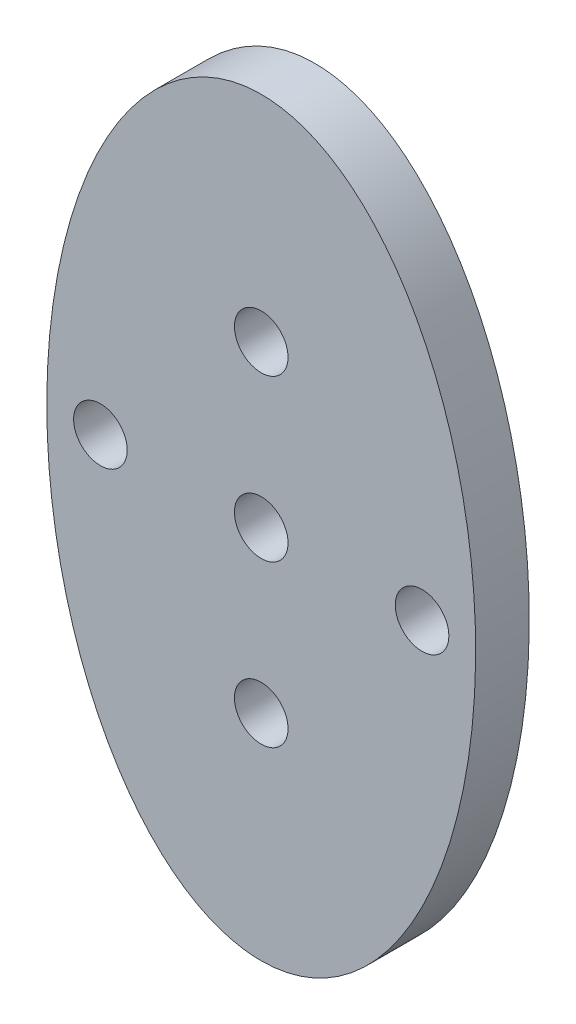
ISO-10303-21;
HEADER;
FILE_DESCRIPTION(('STEP AP214'),'2;1');
FILE_NAME('part.step','',(''),(''),'','','');
FILE_SCHEMA(('AUTOMOTIVE_DESIGN { 1 0 10303 214 1 1 1 1 }'));
ENDSEC;
DATA;
#1=APPLICATION_CONTEXT('core data for automotive mechanical design processes');
#2=APPLICATION_PROTOCOL_DEFINITION('international standard','automotive_design',2000,#1);
#3=PRODUCT_CONTEXT('',#1,'mechanical');
#4=PRODUCT('Part','Part','',(#3));
#5=PRODUCT_RELATED_PRODUCT_CATEGORY('part','',(#4));
#6=PRODUCT_DEFINITION_FORMATION('','',#4);
#7=PRODUCT_DEFINITION_CONTEXT('part definition',#1,'design');
#8=PRODUCT_DEFINITION('design','',#6,#7);
#9=PRODUCT_DEFINITION_SHAPE('','',#8);
#10=(LENGTH_UNIT() NAMED_UNIT(*) SI_UNIT(.MILLI.,.METRE.));
#11=(NAMED_UNIT(*) PLANE_ANGLE_UNIT() SI_UNIT($,.RADIAN.));
#12=(NAMED_UNIT(*) SI_UNIT($,.STERADIAN.) SOLID_ANGLE_UNIT());
#13=UNCERTAINTY_MEASURE_WITH_UNIT(LENGTH_MEASURE(1.E-05),#10,'distance_accuracy_value','');
#14=(GEOMETRIC_REPRESENTATION_CONTEXT(3) GLOBAL_UNCERTAINTY_ASSIGNED_CONTEXT((#13)) GLOBAL_UNIT_ASSIGNED_CONTEXT((#10,
#11,#12)) REPRESENTATION_CONTEXT('',''));
#15=CARTESIAN_POINT('',(0.,0.,0.));
#16=DIRECTION('',(0.,0.,1.));
#17=DIRECTION('',(1.,0.,0.));
#18=AXIS2_PLACEMENT_3D('',#15,#16,#17);
#19=CARTESIAN_POINT('',(299.5187540025,285.8788155958,3.));
#20=DIRECTION('',(0.,0.,1.));
#21=DIRECTION('',(1.,0.,0.));
#22=AXIS2_PLACEMENT_3D('',#19,#20,#21);
#23=PLANE('',#22);
#24=CARTESIAN_POINT('',(290.5187540025,285.8788155958,3.));
#25=DIRECTION('',(0.,0.,1.));
#26=DIRECTION('',(1.,0.,0.));
#27=AXIS2_PLACEMENT_3D('',#24,#25,#26);
#28=CIRCLE('',#27,1.5);
#29=CARTESIAN_POINT('',(292.0187540025,285.8788155958,3.));
#30=VERTEX_POINT('',#29);
#31=EDGE_CURVE('E60',#30,#30,#28,.T.);
#32=ORIENTED_EDGE('',*,*,#31,.F.);
#33=EDGE_LOOP('',(#32));
#34=FACE_BOUND('',#33,.T.);
#35=CARTESIAN_POINT('',(299.5187540025,294.8788155958,3.));
#36=DIRECTION('',(0.,0.,1.));
#37=DIRECTION('',(1.,0.,0.));
#38=AXIS2_PLACEMENT_3D('',#35,#36,#37);
#39=CIRCLE('',#38,1.5);
#40=CARTESIAN_POINT('',(301.0187540025,294.8788155958,3.));
#41=VERTEX_POINT('',#40);
#42=EDGE_CURVE('E48',#41,#41,#39,.T.);
#43=ORIENTED_EDGE('',*,*,#42,.F.);
#44=EDGE_LOOP('',(#43));
#45=FACE_BOUND('',#44,.T.);
#46=CARTESIAN_POINT('',(299.5187540025,285.8788155958,3.));
#47=DIRECTION('',(0.,0.,1.));
#48=DIRECTION('',(0.,-1.,0.));
#49=AXIS2_PLACEMENT_3D('',#46,#47,#48);
#50=ELLIPSE('',#49,21.,11.9999999994);
#51=CARTESIAN_POINT('',(299.5187540025,264.8788155958,3.));
#52=VERTEX_POINT('',#51);
#53=EDGE_CURVE('E10',#52,#52,#50,.T.);
#54=ORIENTED_EDGE('',*,*,#53,.T.);
#55=EDGE_LOOP('',(#54));
#56=FACE_BOUND('',#55,.T.);
#57=CARTESIAN_POINT('',(299.5187540025,276.8788155958,3.));
#58=DIRECTION('',(0.,0.,1.));
#59=DIRECTION('',(1.,0.,0.));
#60=AXIS2_PLACEMENT_3D('',#57,#58,#59);
#61=CIRCLE('',#60,1.5);
#62=CARTESIAN_POINT('',(301.0187540025,276.8788155958,3.));
#63=VERTEX_POINT('',#62);
#64=EDGE_CURVE('E42',#63,#63,#61,.T.);
#65=ORIENTED_EDGE('',*,*,#64,.F.);
#66=EDGE_LOOP('',(#65));
#67=FACE_BOUND('',#66,.T.);
#68=CARTESIAN_POINT('',(308.5187540025,285.8788155958,3.));
#69=DIRECTION('',(0.,0.,1.));
#70=DIRECTION('',(1.,0.,0.));
#71=AXIS2_PLACEMENT_3D('',#68,#69,#70);
#72=CIRCLE('',#71,1.5);
#73=CARTESIAN_POINT('',(310.0187540025,285.8788155958,3.));
#74=VERTEX_POINT('',#73);
#75=EDGE_CURVE('E54',#74,#74,#72,.T.);
#76=ORIENTED_EDGE('',*,*,#75,.F.);
#77=EDGE_LOOP('',(#76));
#78=FACE_BOUND('',#77,.T.);
#79=CARTESIAN_POINT('',(299.5187540025,285.8788155958,3.));
#80=DIRECTION('',(0.,0.,1.));
#81=DIRECTION('',(1.,0.,0.));
#82=AXIS2_PLACEMENT_3D('',#79,#80,#81);
#83=CIRCLE('',#82,1.5);
#84=CARTESIAN_POINT('',(301.0187540025,285.8788155958,3.));
#85=VERTEX_POINT('',#84);
#86=EDGE_CURVE('E66',#85,#85,#83,.T.);
#87=ORIENTED_EDGE('',*,*,#86,.F.);
#88=EDGE_LOOP('',(#87));
#89=FACE_BOUND('',#88,.T.);
#90=ADVANCED_FACE('F31',(#34,#45,#56,#67,#78,#89),#23,.T.);
#91=CARTESIAN_POINT('',(299.5187540025,285.8788155958,0.));
#92=DIRECTION('',(0.,0.,1.));
#93=DIRECTION('',(1.,0.,0.));
#94=AXIS2_PLACEMENT_3D('',#91,#92,#93);
#95=PLANE('',#94);
#96=CARTESIAN_POINT('',(290.5187540025,285.8788155958,0.));
#97=DIRECTION('',(0.,0.,1.));
#98=DIRECTION('',(1.,0.,0.));
#99=AXIS2_PLACEMENT_3D('',#96,#97,#98);
#100=CIRCLE('',#99,1.5);
#101=CARTESIAN_POINT('',(292.0187540025,285.8788155958,0.));
#102=VERTEX_POINT('',#101);
#103=EDGE_CURVE('E63',#102,#102,#100,.T.);
#104=ORIENTED_EDGE('',*,*,#103,.T.);
#105=EDGE_LOOP('',(#104));
#106=FACE_BOUND('',#105,.T.);
#107=CARTESIAN_POINT('',(299.5187540025,294.8788155958,0.));
#108=DIRECTION('',(0.,0.,1.));
#109=DIRECTION('',(1.,0.,0.));
#110=AXIS2_PLACEMENT_3D('',#107,#108,#109);
#111=CIRCLE('',#110,1.5);
#112=CARTESIAN_POINT('',(301.0187540025,294.8788155958,0.));
#113=VERTEX_POINT('',#112);
#114=EDGE_CURVE('E51',#113,#113,#111,.T.);
#115=ORIENTED_EDGE('',*,*,#114,.T.);
#116=EDGE_LOOP('',(#115));
#117=FACE_BOUND('',#116,.T.);
#118=CARTESIAN_POINT('',(299.5187540025,285.8788155958,0.));
#119=DIRECTION('',(0.,0.,1.));
#120=DIRECTION('',(0.,-1.,0.));
#121=AXIS2_PLACEMENT_3D('',#118,#119,#120);
#122=ELLIPSE('',#121,21.,11.9999999994);
#123=CARTESIAN_POINT('',(299.5187540025,264.8788155958,0.));
#124=VERTEX_POINT('',#123);
#125=EDGE_CURVE('E36',#124,#124,#122,.T.);
#126=ORIENTED_EDGE('',*,*,#125,.F.);
#127=EDGE_LOOP('',(#126));
#128=FACE_BOUND('',#127,.T.);
#129=CARTESIAN_POINT('',(299.5187540025,276.8788155958,0.));
#130=DIRECTION('',(0.,0.,1.));
#131=DIRECTION('',(1.,0.,0.));
#132=AXIS2_PLACEMENT_3D('',#129,#130,#131);
#133=CIRCLE('',#132,1.5);
#134=CARTESIAN_POINT('',(301.0187540025,276.8788155958,0.));
#135=VERTEX_POINT('',#134);
#136=EDGE_CURVE('E45',#135,#135,#133,.T.);
#137=ORIENTED_EDGE('',*,*,#136,.T.);
#138=EDGE_LOOP('',(#137));
#139=FACE_BOUND('',#138,.T.);
#140=CARTESIAN_POINT('',(308.5187540025,285.8788155958,0.));
#141=DIRECTION('',(0.,0.,1.));
#142=DIRECTION('',(1.,0.,0.));
#143=AXIS2_PLACEMENT_3D('',#140,#141,#142);
#144=CIRCLE('',#143,1.5);
#145=CARTESIAN_POINT('',(310.0187540025,285.8788155958,0.));
#146=VERTEX_POINT('',#145);
#147=EDGE_CURVE('E57',#146,#146,#144,.T.);
#148=ORIENTED_EDGE('',*,*,#147,.T.);
#149=EDGE_LOOP('',(#148));
#150=FACE_BOUND('',#149,.T.);
#151=CARTESIAN_POINT('',(299.5187540025,285.8788155958,0.));
#152=DIRECTION('',(0.,0.,1.));
#153=DIRECTION('',(1.,0.,0.));
#154=AXIS2_PLACEMENT_3D('',#151,#152,#153);
#155=CIRCLE('',#154,1.5);
#156=CARTESIAN_POINT('',(301.0187540025,285.8788155958,0.));
#157=VERTEX_POINT('',#156);
#158=EDGE_CURVE('E69',#157,#157,#155,.T.);
#159=ORIENTED_EDGE('',*,*,#158,.T.);
#160=EDGE_LOOP('',(#159));
#161=FACE_BOUND('',#160,.T.);
#162=ADVANCED_FACE('F79',(#106,#117,#128,#139,#150,#161),#95,.F.);
#163=DIRECTION('',(0.,0.,-1.));
#164=VECTOR('',#163,1.);
#165=SURFACE_OF_LINEAR_EXTRUSION('',#50,#164);
#166=ORIENTED_EDGE('',*,*,#53,.F.);
#167=EDGE_LOOP('',(#166));
#168=FACE_BOUND('',#167,.T.);
#169=ORIENTED_EDGE('',*,*,#125,.T.);
#170=EDGE_LOOP('',(#169));
#171=FACE_BOUND('',#170,.T.);
#172=ADVANCED_FACE('F33',(#168,#171),#165,.F.);
#173=CARTESIAN_POINT('',(299.5187540025,276.8788155958,3.));
#174=DIRECTION('',(0.,0.,-1.));
#175=DIRECTION('',(-1.,0.,0.));
#176=AXIS2_PLACEMENT_3D('',#173,#174,#175);
#177=CYLINDRICAL_SURFACE('',#176,1.5);
#178=ORIENTED_EDGE('',*,*,#64,.T.);
#179=EDGE_LOOP('',(#178));
#180=FACE_BOUND('',#179,.T.);
#181=ORIENTED_EDGE('',*,*,#136,.F.);
#182=EDGE_LOOP('',(#181));
#183=FACE_BOUND('',#182,.T.);
#184=ADVANCED_FACE('F89',(#180,#183),#177,.F.);
#185=CARTESIAN_POINT('',(299.5187540025,294.8788155958,3.));
#186=DIRECTION('',(0.,0.,-1.));
#187=DIRECTION('',(-1.,0.,0.));
#188=AXIS2_PLACEMENT_3D('',#185,#186,#187);
#189=CYLINDRICAL_SURFACE('',#188,1.5);
#190=ORIENTED_EDGE('',*,*,#42,.T.);
#191=EDGE_LOOP('',(#190));
#192=FACE_BOUND('',#191,.T.);
#193=ORIENTED_EDGE('',*,*,#114,.F.);
#194=EDGE_LOOP('',(#193));
#195=FACE_BOUND('',#194,.T.);
#196=ADVANCED_FACE('F92',(#192,#195),#189,.F.);
#197=CARTESIAN_POINT('',(308.5187540025,285.8788155958,3.));
#198=DIRECTION('',(0.,0.,-1.));
#199=DIRECTION('',(-1.,0.,0.));
#200=AXIS2_PLACEMENT_3D('',#197,#198,#199);
#201=CYLINDRICAL_SURFACE('',#200,1.5);
#202=ORIENTED_EDGE('',*,*,#75,.T.);
#203=EDGE_LOOP('',(#202));
#204=FACE_BOUND('',#203,.T.);
#205=ORIENTED_EDGE('',*,*,#147,.F.);
#206=EDGE_LOOP('',(#205));
#207=FACE_BOUND('',#206,.T.);
#208=ADVANCED_FACE('F96',(#204,#207),#201,.F.);
#209=CARTESIAN_POINT('',(290.5187540025,285.8788155958,3.));
#210=DIRECTION('',(0.,0.,-1.));
#211=DIRECTION('',(-1.,0.,0.));
#212=AXIS2_PLACEMENT_3D('',#209,#210,#211);
#213=CYLINDRICAL_SURFACE('',#212,1.5);
#214=ORIENTED_EDGE('',*,*,#31,.T.);
#215=EDGE_LOOP('',(#214));
#216=FACE_BOUND('',#215,.T.);
#217=ORIENTED_EDGE('',*,*,#103,.F.);
#218=EDGE_LOOP('',(#217));
#219=FACE_BOUND('',#218,.T.);
#220=ADVANCED_FACE('F100',(#216,#219),#213,.F.);
#221=CARTESIAN_POINT('',(299.5187540025,285.8788155958,3.));
#222=DIRECTION('',(0.,0.,-1.));
#223=DIRECTION('',(-1.,0.,0.));
#224=AXIS2_PLACEMENT_3D('',#221,#222,#223);
#225=CYLINDRICAL_SURFACE('',#224,1.5);
#226=ORIENTED_EDGE('',*,*,#86,.T.);
#227=EDGE_LOOP('',(#226));
#228=FACE_BOUND('',#227,.T.);
#229=ORIENTED_EDGE('',*,*,#158,.F.);
#230=EDGE_LOOP('',(#229));
#231=FACE_BOUND('',#230,.T.);
#232=ADVANCED_FACE('F75',(#228,#231),#225,.F.);
#233=CLOSED_SHELL('',(#90,#162,#172,#184,#196,#208,#220,#232));
#234=MANIFOLD_SOLID_BREP('B2',#233);
#235=ADVANCED_BREP_SHAPE_REPRESENTATION('',(#18,#234),#14);
#236=SHAPE_DEFINITION_REPRESENTATION(#9,#235);
ENDSEC;
END-ISO-10303-21;
